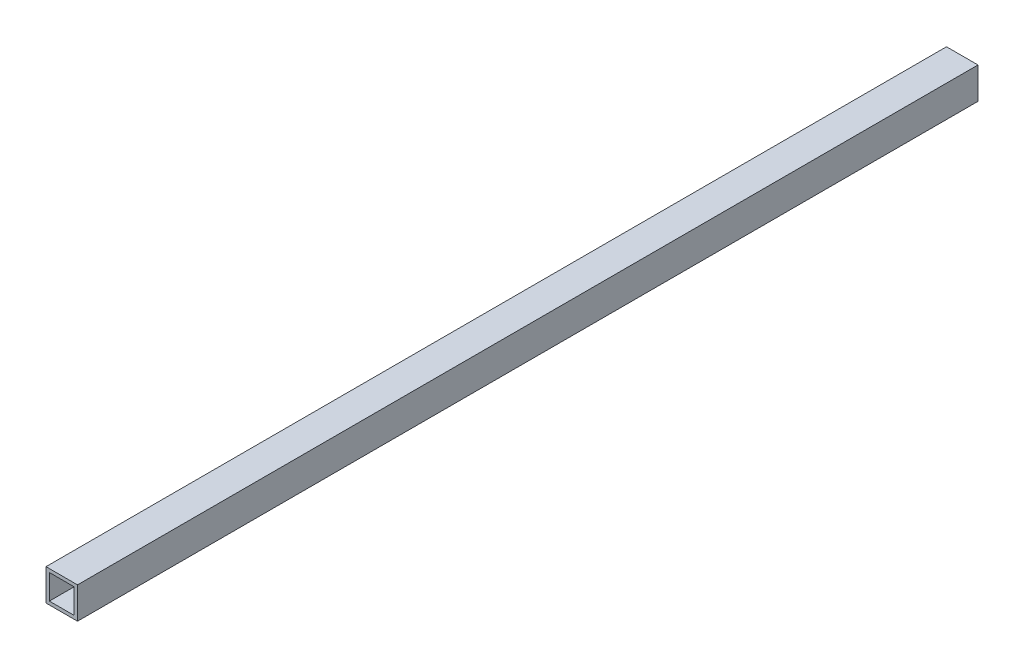
ISO-10303-21;
HEADER;
FILE_DESCRIPTION(('STEP AP214'),'2;1');
FILE_NAME('part.step','',(''),(''),'','','');
FILE_SCHEMA(('AUTOMOTIVE_DESIGN { 1 0 10303 214 1 1 1 1 }'));
ENDSEC;
DATA;
#1=APPLICATION_CONTEXT('core data for automotive mechanical design processes');
#2=APPLICATION_PROTOCOL_DEFINITION('international standard','automotive_design',2000,#1);
#3=PRODUCT_CONTEXT('',#1,'mechanical');
#4=PRODUCT('Part','Part','',(#3));
#5=PRODUCT_RELATED_PRODUCT_CATEGORY('part','',(#4));
#6=PRODUCT_DEFINITION_FORMATION('','',#4);
#7=PRODUCT_DEFINITION_CONTEXT('part definition',#1,'design');
#8=PRODUCT_DEFINITION('design','',#6,#7);
#9=PRODUCT_DEFINITION_SHAPE('','',#8);
#10=(LENGTH_UNIT() NAMED_UNIT(*) SI_UNIT(.MILLI.,.METRE.));
#11=(NAMED_UNIT(*) PLANE_ANGLE_UNIT() SI_UNIT($,.RADIAN.));
#12=(NAMED_UNIT(*) SI_UNIT($,.STERADIAN.) SOLID_ANGLE_UNIT());
#13=UNCERTAINTY_MEASURE_WITH_UNIT(LENGTH_MEASURE(1.E-05),#10,'distance_accuracy_value','');
#14=(GEOMETRIC_REPRESENTATION_CONTEXT(3) GLOBAL_UNCERTAINTY_ASSIGNED_CONTEXT((#13)) GLOBAL_UNIT_ASSIGNED_CONTEXT((#10,
#11,#12)) REPRESENTATION_CONTEXT('',''));
#15=CARTESIAN_POINT('',(0.,0.,0.));
#16=DIRECTION('',(0.,0.,1.));
#17=DIRECTION('',(1.,0.,0.));
#18=AXIS2_PLACEMENT_3D('',#15,#16,#17);
#19=CARTESIAN_POINT('',(0.,0.,400.));
#20=DIRECTION('',(0.,0.,1.));
#21=DIRECTION('',(1.,0.,0.));
#22=AXIS2_PLACEMENT_3D('',#19,#20,#21);
#23=PLANE('',#22);
#24=DIRECTION('',(0.,1.,0.));
#25=VECTOR('',#24,1.);
#26=CARTESIAN_POINT('',(7.,5.5,400.));
#27=LINE('',#26,#25);
#28=CARTESIAN_POINT('',(7.,-7.,400.));
#29=VERTEX_POINT('',#28);
#30=CARTESIAN_POINT('',(7.,7.,400.));
#31=VERTEX_POINT('',#30);
#32=EDGE_CURVE('E158',#29,#31,#27,.T.);
#33=ORIENTED_EDGE('',*,*,#32,.T.);
#34=DIRECTION('',(-1.,0.,0.));
#35=VECTOR('',#34,1.);
#36=CARTESIAN_POINT('',(-5.5,7.,400.));
#37=LINE('',#36,#35);
#38=CARTESIAN_POINT('',(-7.,7.,400.));
#39=VERTEX_POINT('',#38);
#40=EDGE_CURVE('E161',#31,#39,#37,.T.);
#41=ORIENTED_EDGE('',*,*,#40,.T.);
#42=DIRECTION('',(0.,-1.,0.));
#43=VECTOR('',#42,1.);
#44=CARTESIAN_POINT('',(-7.,5.5,400.));
#45=LINE('',#44,#43);
#46=CARTESIAN_POINT('',(-7.,-7.,400.));
#47=VERTEX_POINT('',#46);
#48=EDGE_CURVE('E164',#39,#47,#45,.T.);
#49=ORIENTED_EDGE('',*,*,#48,.T.);
#50=DIRECTION('',(1.,0.,0.));
#51=VECTOR('',#50,1.);
#52=CARTESIAN_POINT('',(-5.5,-7.,400.));
#53=LINE('',#52,#51);
#54=EDGE_CURVE('E166',#47,#29,#53,.T.);
#55=ORIENTED_EDGE('',*,*,#54,.T.);
#56=EDGE_LOOP('',(#33,#41,#49,#55));
#57=FACE_BOUND('',#56,.T.);
#58=DIRECTION('',(-1.,0.,0.));
#59=VECTOR('',#58,1.);
#60=CARTESIAN_POINT('',(-5.5,5.5,400.));
#61=LINE('',#60,#59);
#62=CARTESIAN_POINT('',(5.5,5.5,400.));
#63=VERTEX_POINT('',#62);
#64=CARTESIAN_POINT('',(-5.5,5.5,400.));
#65=VERTEX_POINT('',#64);
#66=EDGE_CURVE('E130',#63,#65,#61,.T.);
#67=ORIENTED_EDGE('',*,*,#66,.F.);
#68=DIRECTION('',(0.,1.,0.));
#69=VECTOR('',#68,1.);
#70=CARTESIAN_POINT('',(5.5,5.5,400.));
#71=LINE('',#70,#69);
#72=CARTESIAN_POINT('',(5.5,-5.5,400.));
#73=VERTEX_POINT('',#72);
#74=EDGE_CURVE('E122',#73,#63,#71,.T.);
#75=ORIENTED_EDGE('',*,*,#74,.F.);
#76=DIRECTION('',(1.,0.,0.));
#77=VECTOR('',#76,1.);
#78=CARTESIAN_POINT('',(-5.5,-5.5,400.));
#79=LINE('',#78,#77);
#80=CARTESIAN_POINT('',(-5.5,-5.5,400.));
#81=VERTEX_POINT('',#80);
#82=EDGE_CURVE('E144',#81,#73,#79,.T.);
#83=ORIENTED_EDGE('',*,*,#82,.F.);
#84=DIRECTION('',(0.,-1.,0.));
#85=VECTOR('',#84,1.);
#86=CARTESIAN_POINT('',(-5.5,5.5,400.));
#87=LINE('',#86,#85);
#88=EDGE_CURVE('E142',#65,#81,#87,.T.);
#89=ORIENTED_EDGE('',*,*,#88,.F.);
#90=EDGE_LOOP('',(#67,#75,#83,#89));
#91=FACE_BOUND('',#90,.T.);
#92=ADVANCED_FACE('F57',(#57,#91),#23,.T.);
#93=CARTESIAN_POINT('',(0.,0.,0.));
#94=DIRECTION('',(0.,0.,1.));
#95=DIRECTION('',(1.,0.,0.));
#96=AXIS2_PLACEMENT_3D('',#93,#94,#95);
#97=PLANE('',#96);
#98=DIRECTION('',(0.,1.,0.));
#99=VECTOR('',#98,1.);
#100=CARTESIAN_POINT('',(7.,5.5,0.));
#101=LINE('',#100,#99);
#102=CARTESIAN_POINT('',(7.,-7.,0.));
#103=VERTEX_POINT('',#102);
#104=CARTESIAN_POINT('',(7.,7.,0.));
#105=VERTEX_POINT('',#104);
#106=EDGE_CURVE('E138',#103,#105,#101,.T.);
#107=ORIENTED_EDGE('',*,*,#106,.F.);
#108=DIRECTION('',(1.,0.,0.));
#109=VECTOR('',#108,1.);
#110=CARTESIAN_POINT('',(-5.5,-7.,0.));
#111=LINE('',#110,#109);
#112=CARTESIAN_POINT('',(-7.,-7.,0.));
#113=VERTEX_POINT('',#112);
#114=EDGE_CURVE('E162',#113,#103,#111,.T.);
#115=ORIENTED_EDGE('',*,*,#114,.F.);
#116=DIRECTION('',(0.,-1.,0.));
#117=VECTOR('',#116,1.);
#118=CARTESIAN_POINT('',(-7.,5.5,0.));
#119=LINE('',#118,#117);
#120=CARTESIAN_POINT('',(-7.,7.,0.));
#121=VERTEX_POINT('',#120);
#122=EDGE_CURVE('E173',#121,#113,#119,.T.);
#123=ORIENTED_EDGE('',*,*,#122,.F.);
#124=DIRECTION('',(-1.,0.,0.));
#125=VECTOR('',#124,1.);
#126=CARTESIAN_POINT('',(-5.5,7.,0.));
#127=LINE('',#126,#125);
#128=EDGE_CURVE('E171',#105,#121,#127,.T.);
#129=ORIENTED_EDGE('',*,*,#128,.F.);
#130=EDGE_LOOP('',(#107,#115,#123,#129));
#131=FACE_BOUND('',#130,.T.);
#132=DIRECTION('',(0.,1.,0.));
#133=VECTOR('',#132,1.);
#134=CARTESIAN_POINT('',(5.5,5.5,0.));
#135=LINE('',#134,#133);
#136=CARTESIAN_POINT('',(5.5,-5.5,0.));
#137=VERTEX_POINT('',#136);
#138=CARTESIAN_POINT('',(5.5,5.5,0.));
#139=VERTEX_POINT('',#138);
#140=EDGE_CURVE('E80',#137,#139,#135,.T.);
#141=ORIENTED_EDGE('',*,*,#140,.T.);
#142=DIRECTION('',(-1.,0.,0.));
#143=VECTOR('',#142,1.);
#144=CARTESIAN_POINT('',(-5.5,5.5,0.));
#145=LINE('',#144,#143);
#146=CARTESIAN_POINT('',(-5.5,5.5,0.));
#147=VERTEX_POINT('',#146);
#148=EDGE_CURVE('E137',#139,#147,#145,.T.);
#149=ORIENTED_EDGE('',*,*,#148,.T.);
#150=DIRECTION('',(0.,-1.,0.));
#151=VECTOR('',#150,1.);
#152=CARTESIAN_POINT('',(-5.5,5.5,0.));
#153=LINE('',#152,#151);
#154=CARTESIAN_POINT('',(-5.5,-5.5,0.));
#155=VERTEX_POINT('',#154);
#156=EDGE_CURVE('E150',#147,#155,#153,.T.);
#157=ORIENTED_EDGE('',*,*,#156,.T.);
#158=DIRECTION('',(1.,0.,0.));
#159=VECTOR('',#158,1.);
#160=CARTESIAN_POINT('',(-5.5,-5.5,0.));
#161=LINE('',#160,#159);
#162=EDGE_CURVE('E131',#155,#137,#161,.T.);
#163=ORIENTED_EDGE('',*,*,#162,.T.);
#164=EDGE_LOOP('',(#141,#149,#157,#163));
#165=FACE_BOUND('',#164,.T.);
#166=ADVANCED_FACE('F191',(#131,#165),#97,.F.);
#167=CARTESIAN_POINT('',(7.,5.5,400.));
#168=DIRECTION('',(-1.,0.,0.));
#169=DIRECTION('',(0.,-1.,0.));
#170=AXIS2_PLACEMENT_3D('',#167,#168,#169);
#171=PLANE('',#170);
#172=ORIENTED_EDGE('',*,*,#106,.T.);
#173=DIRECTION('',(0.,0.,-1.));
#174=VECTOR('',#173,1.);
#175=CARTESIAN_POINT('',(7.,7.,400.));
#176=LINE('',#175,#174);
#177=EDGE_CURVE('E12',#31,#105,#176,.T.);
#178=ORIENTED_EDGE('',*,*,#177,.F.);
#179=ORIENTED_EDGE('',*,*,#32,.F.);
#180=DIRECTION('',(0.,0.,-1.));
#181=VECTOR('',#180,1.);
#182=CARTESIAN_POINT('',(7.,-7.,400.));
#183=LINE('',#182,#181);
#184=EDGE_CURVE('E168',#29,#103,#183,.T.);
#185=ORIENTED_EDGE('',*,*,#184,.T.);
#186=EDGE_LOOP('',(#172,#178,#179,#185));
#187=FACE_BOUND('',#186,.T.);
#188=ADVANCED_FACE('F59',(#187),#171,.F.);
#189=CARTESIAN_POINT('',(-5.5,7.,400.));
#190=DIRECTION('',(0.,-1.,0.));
#191=DIRECTION('',(0.,0.,-1.));
#192=AXIS2_PLACEMENT_3D('',#189,#190,#191);
#193=PLANE('',#192);
#194=ORIENTED_EDGE('',*,*,#128,.T.);
#195=DIRECTION('',(0.,0.,-1.));
#196=VECTOR('',#195,1.);
#197=CARTESIAN_POINT('',(-7.,7.,400.));
#198=LINE('',#197,#196);
#199=EDGE_CURVE('E65',#39,#121,#198,.T.);
#200=ORIENTED_EDGE('',*,*,#199,.F.);
#201=ORIENTED_EDGE('',*,*,#40,.F.);
#202=ORIENTED_EDGE('',*,*,#177,.T.);
#203=EDGE_LOOP('',(#194,#200,#201,#202));
#204=FACE_BOUND('',#203,.T.);
#205=ADVANCED_FACE('F201',(#204),#193,.F.);
#206=CARTESIAN_POINT('',(-7.,5.5,400.));
#207=DIRECTION('',(1.,0.,0.));
#208=DIRECTION('',(0.,1.,0.));
#209=AXIS2_PLACEMENT_3D('',#206,#207,#208);
#210=PLANE('',#209);
#211=ORIENTED_EDGE('',*,*,#122,.T.);
#212=DIRECTION('',(0.,0.,-1.));
#213=VECTOR('',#212,1.);
#214=CARTESIAN_POINT('',(-7.,-7.,400.));
#215=LINE('',#214,#213);
#216=EDGE_CURVE('E178',#47,#113,#215,.T.);
#217=ORIENTED_EDGE('',*,*,#216,.F.);
#218=ORIENTED_EDGE('',*,*,#48,.F.);
#219=ORIENTED_EDGE('',*,*,#199,.T.);
#220=EDGE_LOOP('',(#211,#217,#218,#219));
#221=FACE_BOUND('',#220,.T.);
#222=ADVANCED_FACE('F185',(#221),#210,.F.);
#223=CARTESIAN_POINT('',(-5.5,-7.,400.));
#224=DIRECTION('',(0.,1.,0.));
#225=DIRECTION('',(0.,0.,1.));
#226=AXIS2_PLACEMENT_3D('',#223,#224,#225);
#227=PLANE('',#226);
#228=ORIENTED_EDGE('',*,*,#114,.T.);
#229=ORIENTED_EDGE('',*,*,#184,.F.);
#230=ORIENTED_EDGE('',*,*,#54,.F.);
#231=ORIENTED_EDGE('',*,*,#216,.T.);
#232=EDGE_LOOP('',(#228,#229,#230,#231));
#233=FACE_BOUND('',#232,.T.);
#234=ADVANCED_FACE('F195',(#233),#227,.F.);
#235=CARTESIAN_POINT('',(5.5,5.5,400.));
#236=DIRECTION('',(-1.,0.,0.));
#237=DIRECTION('',(0.,-1.,0.));
#238=AXIS2_PLACEMENT_3D('',#235,#236,#237);
#239=PLANE('',#238);
#240=ORIENTED_EDGE('',*,*,#140,.F.);
#241=DIRECTION('',(0.,0.,-1.));
#242=VECTOR('',#241,1.);
#243=CARTESIAN_POINT('',(5.5,-5.5,400.));
#244=LINE('',#243,#242);
#245=EDGE_CURVE('E126',#73,#137,#244,.T.);
#246=ORIENTED_EDGE('',*,*,#245,.F.);
#247=ORIENTED_EDGE('',*,*,#74,.T.);
#248=DIRECTION('',(0.,0.,-1.));
#249=VECTOR('',#248,1.);
#250=CARTESIAN_POINT('',(5.5,5.5,400.));
#251=LINE('',#250,#249);
#252=EDGE_CURVE('E125',#63,#139,#251,.T.);
#253=ORIENTED_EDGE('',*,*,#252,.T.);
#254=EDGE_LOOP('',(#240,#246,#247,#253));
#255=FACE_BOUND('',#254,.T.);
#256=ADVANCED_FACE('F124',(#255),#239,.T.);
#257=CARTESIAN_POINT('',(-5.5,5.5,400.));
#258=DIRECTION('',(0.,-1.,0.));
#259=DIRECTION('',(0.,0.,-1.));
#260=AXIS2_PLACEMENT_3D('',#257,#258,#259);
#261=PLANE('',#260);
#262=ORIENTED_EDGE('',*,*,#148,.F.);
#263=ORIENTED_EDGE('',*,*,#252,.F.);
#264=ORIENTED_EDGE('',*,*,#66,.T.);
#265=DIRECTION('',(0.,0.,-1.));
#266=VECTOR('',#265,1.);
#267=CARTESIAN_POINT('',(-5.5,5.5,400.));
#268=LINE('',#267,#266);
#269=EDGE_CURVE('E139',#65,#147,#268,.T.);
#270=ORIENTED_EDGE('',*,*,#269,.T.);
#271=EDGE_LOOP('',(#262,#263,#264,#270));
#272=FACE_BOUND('',#271,.T.);
#273=ADVANCED_FACE('F134',(#272),#261,.T.);
#274=CARTESIAN_POINT('',(-5.5,5.5,400.));
#275=DIRECTION('',(1.,0.,0.));
#276=DIRECTION('',(0.,1.,0.));
#277=AXIS2_PLACEMENT_3D('',#274,#275,#276);
#278=PLANE('',#277);
#279=ORIENTED_EDGE('',*,*,#156,.F.);
#280=ORIENTED_EDGE('',*,*,#269,.F.);
#281=ORIENTED_EDGE('',*,*,#88,.T.);
#282=DIRECTION('',(0.,0.,-1.));
#283=VECTOR('',#282,1.);
#284=CARTESIAN_POINT('',(-5.5,-5.5,400.));
#285=LINE('',#284,#283);
#286=EDGE_CURVE('E72',#81,#155,#285,.T.);
#287=ORIENTED_EDGE('',*,*,#286,.T.);
#288=EDGE_LOOP('',(#279,#280,#281,#287));
#289=FACE_BOUND('',#288,.T.);
#290=ADVANCED_FACE('F224',(#289),#278,.T.);
#291=CARTESIAN_POINT('',(-5.5,-5.5,400.));
#292=DIRECTION('',(0.,1.,0.));
#293=DIRECTION('',(0.,0.,1.));
#294=AXIS2_PLACEMENT_3D('',#291,#292,#293);
#295=PLANE('',#294);
#296=ORIENTED_EDGE('',*,*,#162,.F.);
#297=ORIENTED_EDGE('',*,*,#286,.F.);
#298=ORIENTED_EDGE('',*,*,#82,.T.);
#299=ORIENTED_EDGE('',*,*,#245,.T.);
#300=EDGE_LOOP('',(#296,#297,#298,#299));
#301=FACE_BOUND('',#300,.T.);
#302=ADVANCED_FACE('F228',(#301),#295,.T.);
#303=CLOSED_SHELL('',(#92,#166,#188,#205,#222,#234,#256,#273,#290,#302));
#304=MANIFOLD_SOLID_BREP('B2',#303);
#305=ADVANCED_BREP_SHAPE_REPRESENTATION('',(#18,#304),#14);
#306=SHAPE_DEFINITION_REPRESENTATION(#9,#305);
ENDSEC;
END-ISO-10303-21;
